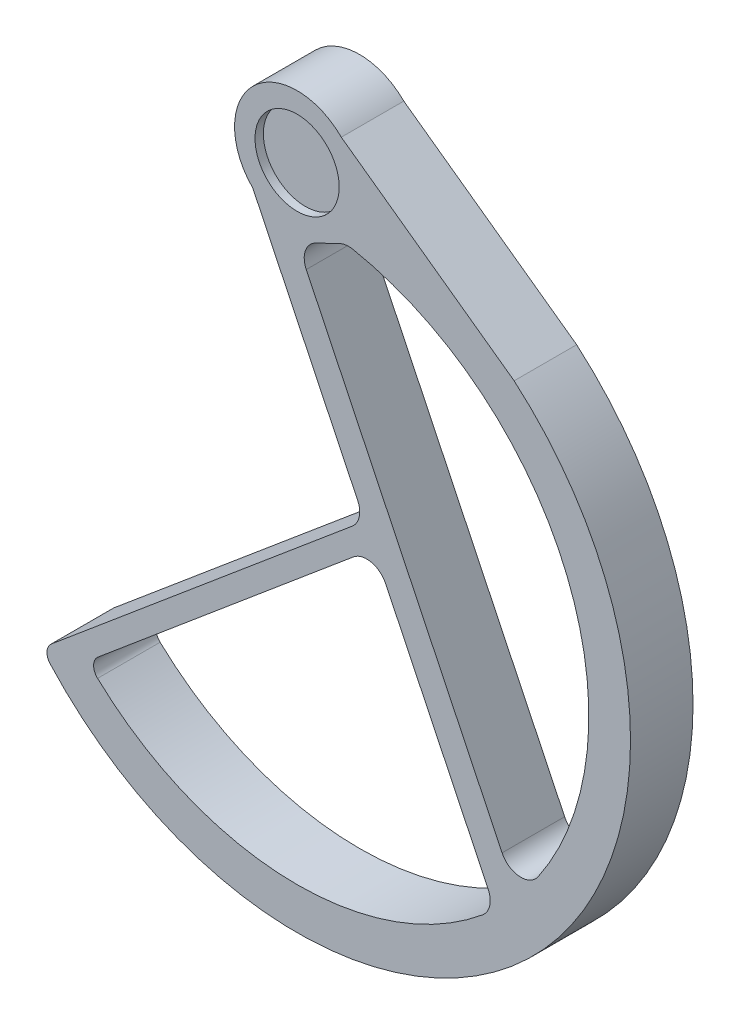
ISO-10303-21;
HEADER;
FILE_DESCRIPTION(('STEP AP214'),'2;1');
FILE_NAME('part.step','',(''),(''),'','','');
FILE_SCHEMA(('AUTOMOTIVE_DESIGN { 1 0 10303 214 1 1 1 1 }'));
ENDSEC;
DATA;
#1=APPLICATION_CONTEXT('core data for automotive mechanical design processes');
#2=APPLICATION_PROTOCOL_DEFINITION('international standard','automotive_design',2000,#1);
#3=PRODUCT_CONTEXT('',#1,'mechanical');
#4=PRODUCT('Part','Part','',(#3));
#5=PRODUCT_RELATED_PRODUCT_CATEGORY('part','',(#4));
#6=PRODUCT_DEFINITION_FORMATION('','',#4);
#7=PRODUCT_DEFINITION_CONTEXT('part definition',#1,'design');
#8=PRODUCT_DEFINITION('design','',#6,#7);
#9=PRODUCT_DEFINITION_SHAPE('','',#8);
#10=(LENGTH_UNIT() NAMED_UNIT(*) SI_UNIT(.MILLI.,.METRE.));
#11=(NAMED_UNIT(*) PLANE_ANGLE_UNIT() SI_UNIT($,.RADIAN.));
#12=(NAMED_UNIT(*) SI_UNIT($,.STERADIAN.) SOLID_ANGLE_UNIT());
#13=UNCERTAINTY_MEASURE_WITH_UNIT(LENGTH_MEASURE(1.E-05),#10,'distance_accuracy_value','');
#14=(GEOMETRIC_REPRESENTATION_CONTEXT(3) GLOBAL_UNCERTAINTY_ASSIGNED_CONTEXT((#13)) GLOBAL_UNIT_ASSIGNED_CONTEXT((#10,
#11,#12)) REPRESENTATION_CONTEXT('',''));
#15=CARTESIAN_POINT('',(0.,0.,0.));
#16=DIRECTION('',(0.,0.,1.));
#17=DIRECTION('',(1.,0.,0.));
#18=AXIS2_PLACEMENT_3D('',#15,#16,#17);
#19=CARTESIAN_POINT('',(-12.7570586950624,-6.1348621133076,15.));
#20=DIRECTION('',(0.901206602628173,0.433389731511241,0.));
#21=DIRECTION('',(-0.433389731511241,0.901206602628173,0.));
#22=AXIS2_PLACEMENT_3D('',#19,#20,#21);
#23=PLANE('',#22);
#24=DIRECTION('',(0.433389731511241,-0.901206602628173,0.));
#25=VECTOR('',#24,1.);
#26=CARTESIAN_POINT('',(-12.7570586950624,-6.1348621133076,0.));
#27=LINE('',#26,#25);
#28=CARTESIAN_POINT('',(21.2324006956412,-76.8137984043253,0.));
#29=VERTEX_POINT('',#28);
#30=CARTESIAN_POINT('',(45.844843506453,-127.9938203457,0.));
#31=VERTEX_POINT('',#30);
#32=EDGE_CURVE('E277',#29,#31,#27,.T.);
#33=ORIENTED_EDGE('',*,*,#32,.T.);
#34=DIRECTION('',(0.,0.,-1.));
#35=VECTOR('',#34,1.);
#36=CARTESIAN_POINT('',(45.844843506453,-127.9938203457,15.));
#37=LINE('',#36,#35);
#38=CARTESIAN_POINT('',(45.844843506453,-127.9938203457,15.));
#39=VERTEX_POINT('',#38);
#40=EDGE_CURVE('E11',#39,#31,#37,.T.);
#41=ORIENTED_EDGE('',*,*,#40,.F.);
#42=DIRECTION('',(0.433389731511241,-0.901206602628173,0.));
#43=VECTOR('',#42,1.);
#44=CARTESIAN_POINT('',(-12.7570586950624,-6.1348621133076,15.));
#45=LINE('',#44,#43);
#46=CARTESIAN_POINT('',(21.2324006956412,-76.8137984043253,15.));
#47=VERTEX_POINT('',#46);
#48=EDGE_CURVE('E243',#47,#39,#45,.T.);
#49=ORIENTED_EDGE('',*,*,#48,.F.);
#50=DIRECTION('',(0.,0.,-1.));
#51=VECTOR('',#50,1.);
#52=CARTESIAN_POINT('',(21.2324006956412,-76.8137984043253,15.));
#53=LINE('',#52,#51);
#54=EDGE_CURVE('E291',#47,#29,#53,.T.);
#55=ORIENTED_EDGE('',*,*,#54,.T.);
#56=EDGE_LOOP('',(#33,#41,#49,#55));
#57=FACE_BOUND('',#56,.T.);
#58=ADVANCED_FACE('F34',(#57),#23,.F.);
#59=CARTESIAN_POINT('',(41.3388104933121,-130.160769003256,15.));
#60=DIRECTION('',(0.,0.,-1.));
#61=DIRECTION('',(-1.,0.,0.));
#62=AXIS2_PLACEMENT_3D('',#59,#60,#61);
#63=CYLINDRICAL_SURFACE('',#62,4.99999999999999);
#64=CARTESIAN_POINT('',(41.3388104933121,-130.160769003256,0.));
#65=DIRECTION('',(0.,0.,1.));
#66=DIRECTION('',(1.,0.,0.));
#67=AXIS2_PLACEMENT_3D('',#64,#65,#66);
#68=CIRCLE('',#67,4.99999999999999);
#69=CARTESIAN_POINT('',(44.5187189927976,-134.019289695814,0.));
#70=VERTEX_POINT('',#69);
#71=EDGE_CURVE('E280',#31,#70,#68,.F.);
#72=ORIENTED_EDGE('',*,*,#71,.T.);
#73=DIRECTION('',(0.,0.,-1.));
#74=VECTOR('',#73,1.);
#75=CARTESIAN_POINT('',(44.5187189927976,-134.019289695814,15.));
#76=LINE('',#75,#74);
#77=CARTESIAN_POINT('',(44.5187189927976,-134.019289695814,15.));
#78=VERTEX_POINT('',#77);
#79=EDGE_CURVE('E43',#78,#70,#76,.T.);
#80=ORIENTED_EDGE('',*,*,#79,.F.);
#81=CARTESIAN_POINT('',(41.3388104933121,-130.160769003256,15.));
#82=DIRECTION('',(0.,0.,1.));
#83=DIRECTION('',(1.,0.,0.));
#84=AXIS2_PLACEMENT_3D('',#81,#82,#83);
#85=CIRCLE('',#84,4.99999999999999);
#86=EDGE_CURVE('E246',#39,#78,#85,.F.);
#87=ORIENTED_EDGE('',*,*,#86,.F.);
#88=ORIENTED_EDGE('',*,*,#40,.T.);
#89=EDGE_LOOP('',(#72,#80,#87,#88));
#90=FACE_BOUND('',#89,.T.);
#91=ADVANCED_FACE('F357',(#90),#63,.F.);
#92=CARTESIAN_POINT('',(0.,-80.,15.));
#93=DIRECTION('',(0.,0.,-1.));
#94=DIRECTION('',(-1.,0.,0.));
#95=AXIS2_PLACEMENT_3D('',#92,#93,#94);
#96=CYLINDRICAL_SURFACE('',#95,70.);
#97=CARTESIAN_POINT('',(0.,-80.,0.));
#98=DIRECTION('',(0.,0.,1.));
#99=DIRECTION('',(1.,0.,0.));
#100=AXIS2_PLACEMENT_3D('',#97,#98,#99);
#101=CIRCLE('',#100,70.);
#102=CARTESIAN_POINT('',(-47.870174388264,-131.072951785042,0.));
#103=VERTEX_POINT('',#102);
#104=EDGE_CURVE('E283',#103,#70,#101,.T.);
#105=ORIENTED_EDGE('',*,*,#104,.F.);
#106=DIRECTION('',(0.,0.,-1.));
#107=VECTOR('',#106,1.);
#108=CARTESIAN_POINT('',(-47.870174388264,-131.072951785042,15.));
#109=LINE('',#108,#107);
#110=CARTESIAN_POINT('',(-47.870174388264,-131.072951785042,15.));
#111=VERTEX_POINT('',#110);
#112=EDGE_CURVE('E300',#111,#103,#109,.T.);
#113=ORIENTED_EDGE('',*,*,#112,.F.);
#114=CARTESIAN_POINT('',(0.,-80.,15.));
#115=DIRECTION('',(0.,0.,1.));
#116=DIRECTION('',(1.,0.,0.));
#117=AXIS2_PLACEMENT_3D('',#114,#115,#116);
#118=CIRCLE('',#117,70.);
#119=EDGE_CURVE('E248',#111,#78,#118,.T.);
#120=ORIENTED_EDGE('',*,*,#119,.T.);
#121=ORIENTED_EDGE('',*,*,#79,.T.);
#122=EDGE_LOOP('',(#105,#113,#120,#121));
#123=FACE_BOUND('',#122,.T.);
#124=ADVANCED_FACE('F363',(#123),#96,.F.);
#125=CARTESIAN_POINT('',(-45.8185954859101,-128.884110994254,15.));
#126=DIRECTION('',(0.,0.,-1.));
#127=DIRECTION('',(-1.,0.,0.));
#128=AXIS2_PLACEMENT_3D('',#125,#126,#127);
#129=CYLINDRICAL_SURFACE('',#128,2.99999999999979);
#130=CARTESIAN_POINT('',(-45.8185954859101,-128.884110994254,0.));
#131=DIRECTION('',(0.,0.,1.));
#132=DIRECTION('',(1.,0.,0.));
#133=AXIS2_PLACEMENT_3D('',#130,#131,#132);
#134=CIRCLE('',#133,2.99999999999979);
#135=CARTESIAN_POINT('',(-47.7476784165524,-126.586582094174,0.));
#136=VERTEX_POINT('',#135);
#137=EDGE_CURVE('E286',#103,#136,#134,.F.);
#138=ORIENTED_EDGE('',*,*,#137,.T.);
#139=DIRECTION('',(0.,0.,-1.));
#140=VECTOR('',#139,1.);
#141=CARTESIAN_POINT('',(-47.7476784165524,-126.586582094174,15.));
#142=LINE('',#141,#140);
#143=CARTESIAN_POINT('',(-47.7476784165524,-126.586582094174,15.));
#144=VERTEX_POINT('',#143);
#145=EDGE_CURVE('E297',#144,#136,#142,.T.);
#146=ORIENTED_EDGE('',*,*,#145,.F.);
#147=CARTESIAN_POINT('',(-45.8185954859101,-128.884110994254,15.));
#148=DIRECTION('',(0.,0.,1.));
#149=DIRECTION('',(1.,0.,0.));
#150=AXIS2_PLACEMENT_3D('',#147,#148,#149);
#151=CIRCLE('',#150,2.99999999999979);
#152=EDGE_CURVE('E251',#111,#144,#151,.F.);
#153=ORIENTED_EDGE('',*,*,#152,.F.);
#154=ORIENTED_EDGE('',*,*,#112,.T.);
#155=EDGE_LOOP('',(#138,#146,#153,#154));
#156=FACE_BOUND('',#155,.T.);
#157=ADVANCED_FACE('F369',(#156),#129,.F.);
#158=CARTESIAN_POINT('',(42.5956727933285,-50.7312504333006,15.));
#159=DIRECTION('',(-0.643027643547508,0.765842966693394,0.));
#160=DIRECTION('',(-0.765842966693394,-0.643027643547508,0.));
#161=AXIS2_PLACEMENT_3D('',#158,#159,#160);
#162=PLANE('',#161);
#163=DIRECTION('',(0.765842966693394,0.643027643547508,0.));
#164=VECTOR('',#163,1.);
#165=CARTESIAN_POINT('',(42.5956727933285,-50.7312504333006,0.));
#166=LINE('',#165,#164);
#167=CARTESIAN_POINT('',(13.5112294647628,-75.1515322284145,0.));
#168=VERTEX_POINT('',#167);
#169=EDGE_CURVE('E288',#136,#168,#166,.T.);
#170=ORIENTED_EDGE('',*,*,#169,.T.);
#171=DIRECTION('',(0.,0.,-1.));
#172=VECTOR('',#171,1.);
#173=CARTESIAN_POINT('',(13.5112294647628,-75.1515322284145,15.));
#174=LINE('',#173,#172);
#175=CARTESIAN_POINT('',(13.5112294647628,-75.1515322284145,15.));
#176=VERTEX_POINT('',#175);
#177=EDGE_CURVE('E294',#176,#168,#174,.T.);
#178=ORIENTED_EDGE('',*,*,#177,.F.);
#179=DIRECTION('',(0.765842966693394,0.643027643547508,0.));
#180=VECTOR('',#179,1.);
#181=CARTESIAN_POINT('',(42.5956727933285,-50.7312504333006,15.));
#182=LINE('',#181,#180);
#183=EDGE_CURVE('E253',#144,#176,#182,.T.);
#184=ORIENTED_EDGE('',*,*,#183,.F.);
#185=ORIENTED_EDGE('',*,*,#145,.T.);
#186=EDGE_LOOP('',(#170,#178,#184,#185));
#187=FACE_BOUND('',#186,.T.);
#188=ADVANCED_FACE('F373',(#187),#162,.F.);
#189=CARTESIAN_POINT('',(10.0302471408598,-65.0565868768263,15.));
#190=DIRECTION('',(0.,0.,-1.));
#191=DIRECTION('',(-1.,0.,0.));
#192=AXIS2_PLACEMENT_3D('',#189,#190,#191);
#193=CYLINDRICAL_SURFACE('',#192,5.);
#194=CARTESIAN_POINT('',(10.0302471408598,-65.0565868768263,0.));
#195=DIRECTION('',(0.,0.,1.));
#196=DIRECTION('',(1.,0.,0.));
#197=AXIS2_PLACEMENT_3D('',#194,#195,#196);
#198=CIRCLE('',#197,5.);
#199=CARTESIAN_POINT('',(13.2441851892925,-68.8868090924212,0.));
#200=VERTEX_POINT('',#199);
#201=CARTESIAN_POINT('',(14.5362801540007,-62.8896382192701,0.));
#202=VERTEX_POINT('',#201);
#203=EDGE_CURVE('E216',#200,#202,#198,.T.);
#204=ORIENTED_EDGE('',*,*,#203,.F.);
#205=DIRECTION('',(0.,0.,-1.));
#206=VECTOR('',#205,1.);
#207=CARTESIAN_POINT('',(13.2441851892925,-68.8868090924212,15.));
#208=LINE('',#207,#206);
#209=CARTESIAN_POINT('',(13.2441851892925,-68.8868090924212,15.));
#210=VERTEX_POINT('',#209);
#211=EDGE_CURVE('E38',#210,#200,#208,.T.);
#212=ORIENTED_EDGE('',*,*,#211,.F.);
#213=CARTESIAN_POINT('',(10.0302471408598,-65.0565868768263,15.));
#214=DIRECTION('',(0.,0.,1.));
#215=DIRECTION('',(1.,0.,0.));
#216=AXIS2_PLACEMENT_3D('',#213,#214,#215);
#217=CIRCLE('',#216,5.);
#218=CARTESIAN_POINT('',(14.5362801540007,-62.8896382192701,15.));
#219=VERTEX_POINT('',#218);
#220=EDGE_CURVE('E224',#210,#219,#217,.T.);
#221=ORIENTED_EDGE('',*,*,#220,.T.);
#222=DIRECTION('',(0.,0.,-1.));
#223=VECTOR('',#222,1.);
#224=CARTESIAN_POINT('',(14.5362801540007,-62.8896382192701,15.));
#225=LINE('',#224,#223);
#226=EDGE_CURVE('E257',#219,#202,#225,.T.);
#227=ORIENTED_EDGE('',*,*,#226,.T.);
#228=EDGE_LOOP('',(#204,#212,#221,#227));
#229=FACE_BOUND('',#228,.T.);
#230=ADVANCED_FACE('F36',(#229),#193,.F.);
#231=CARTESIAN_POINT('',(39.3923101204882,-46.9459271066778,15.));
#232=DIRECTION('',(-0.642787609686534,0.766044443118983,0.));
#233=DIRECTION('',(-0.766044443118982,-0.642787609686534,0.));
#234=AXIS2_PLACEMENT_3D('',#231,#232,#233);
#235=PLANE('',#234);
#236=DIRECTION('',(0.766044443118982,0.642787609686534,0.));
#237=VECTOR('',#236,1.);
#238=CARTESIAN_POINT('',(39.3923101204882,-46.9459271066778,0.));
#239=LINE('',#238,#237);
#240=CARTESIAN_POINT('',(-58.9406362868111,-129.457066169617,0.));
#241=VERTEX_POINT('',#240);
#242=EDGE_CURVE('E260',#241,#200,#239,.T.);
#243=ORIENTED_EDGE('',*,*,#242,.F.);
#244=DIRECTION('',(0.,0.,-1.));
#245=VECTOR('',#244,1.);
#246=CARTESIAN_POINT('',(-58.9406362868111,-129.457066169617,15.));
#247=LINE('',#246,#245);
#248=CARTESIAN_POINT('',(-58.9406362868111,-129.457066169617,15.));
#249=VERTEX_POINT('',#248);
#250=EDGE_CURVE('E312',#249,#241,#247,.T.);
#251=ORIENTED_EDGE('',*,*,#250,.F.);
#252=DIRECTION('',(0.766044443118982,0.642787609686534,0.));
#253=VECTOR('',#252,1.);
#254=CARTESIAN_POINT('',(39.3923101204882,-46.9459271066778,15.));
#255=LINE('',#254,#253);
#256=EDGE_CURVE('E227',#249,#210,#255,.T.);
#257=ORIENTED_EDGE('',*,*,#256,.T.);
#258=ORIENTED_EDGE('',*,*,#211,.T.);
#259=EDGE_LOOP('',(#243,#251,#257,#258));
#260=FACE_BOUND('',#259,.T.);
#261=ADVANCED_FACE('F318',(#260),#235,.T.);
#262=CARTESIAN_POINT('',(-57.0122734577518,-131.755199498973,15.));
#263=DIRECTION('',(0.,0.,-1.));
#264=DIRECTION('',(-1.,0.,0.));
#265=AXIS2_PLACEMENT_3D('',#262,#263,#264);
#266=CYLINDRICAL_SURFACE('',#265,2.99999999999976);
#267=CARTESIAN_POINT('',(-57.0122734577518,-131.755199498973,0.));
#268=DIRECTION('',(0.,0.,1.));
#269=DIRECTION('',(1.,0.,0.));
#270=AXIS2_PLACEMENT_3D('',#267,#268,#269);
#271=CIRCLE('',#270,2.99999999999976);
#272=CARTESIAN_POINT('',(-59.2335308651964,-133.771635843089,0.));
#273=VERTEX_POINT('',#272);
#274=EDGE_CURVE('E263',#273,#241,#271,.F.);
#275=ORIENTED_EDGE('',*,*,#274,.F.);
#276=DIRECTION('',(0.,0.,-1.));
#277=VECTOR('',#276,1.);
#278=CARTESIAN_POINT('',(-59.2335308651964,-133.771635843089,15.));
#279=LINE('',#278,#277);
#280=CARTESIAN_POINT('',(-59.2335308651964,-133.771635843089,15.));
#281=VERTEX_POINT('',#280);
#282=EDGE_CURVE('E311',#281,#273,#279,.T.);
#283=ORIENTED_EDGE('',*,*,#282,.F.);
#284=CARTESIAN_POINT('',(-57.0122734577518,-131.755199498973,15.));
#285=DIRECTION('',(0.,0.,1.));
#286=DIRECTION('',(1.,0.,0.));
#287=AXIS2_PLACEMENT_3D('',#284,#285,#286);
#288=CIRCLE('',#287,2.99999999999976);
#289=EDGE_CURVE('E231',#281,#249,#288,.F.);
#290=ORIENTED_EDGE('',*,*,#289,.T.);
#291=ORIENTED_EDGE('',*,*,#250,.T.);
#292=EDGE_LOOP('',(#275,#283,#290,#291));
#293=FACE_BOUND('',#292,.T.);
#294=ADVANCED_FACE('F326',(#293),#266,.T.);
#295=CARTESIAN_POINT('',(0.,-80.,15.));
#296=DIRECTION('',(0.,0.,-1.));
#297=DIRECTION('',(-1.,0.,0.));
#298=AXIS2_PLACEMENT_3D('',#295,#296,#297);
#299=CYLINDRICAL_SURFACE('',#298,80.);
#300=CARTESIAN_POINT('',(0.,-80.,0.));
#301=DIRECTION('',(0.,0.,1.));
#302=DIRECTION('',(1.,0.,0.));
#303=AXIS2_PLACEMENT_3D('',#300,#301,#302);
#304=CIRCLE('',#303,80.);
#305=CARTESIAN_POINT('',(52.0761789176773,-19.2705047828153,0.));
#306=VERTEX_POINT('',#305);
#307=EDGE_CURVE('E266',#273,#306,#304,.T.);
#308=ORIENTED_EDGE('',*,*,#307,.T.);
#309=DIRECTION('',(0.,0.,-1.));
#310=VECTOR('',#309,1.);
#311=CARTESIAN_POINT('',(52.0761789176773,-19.2705047828153,15.));
#312=LINE('',#311,#310);
#313=CARTESIAN_POINT('',(52.0761789176773,-19.2705047828153,15.));
#314=VERTEX_POINT('',#313);
#315=EDGE_CURVE('E309',#314,#306,#312,.T.);
#316=ORIENTED_EDGE('',*,*,#315,.F.);
#317=CARTESIAN_POINT('',(0.,-80.,15.));
#318=DIRECTION('',(0.,0.,1.));
#319=DIRECTION('',(1.,0.,0.));
#320=AXIS2_PLACEMENT_3D('',#317,#318,#319);
#321=CIRCLE('',#320,80.);
#322=EDGE_CURVE('E234',#281,#314,#321,.T.);
#323=ORIENTED_EDGE('',*,*,#322,.F.);
#324=ORIENTED_EDGE('',*,*,#282,.T.);
#325=EDGE_LOOP('',(#308,#316,#323,#324));
#326=FACE_BOUND('',#325,.T.);
#327=ADVANCED_FACE('F331',(#326),#299,.T.);
#328=CARTESIAN_POINT('',(8.65474635415258,12.0128323695446,15.));
#329=DIRECTION('',(0.584549661802916,0.811357931424902,0.));
#330=DIRECTION('',(-0.811357931424902,0.584549661802916,0.));
#331=AXIS2_PLACEMENT_3D('',#328,#329,#330);
#332=PLANE('',#331);
#333=DIRECTION('',(0.811357931424902,-0.584549661802916,0.));
#334=VECTOR('',#333,1.);
#335=CARTESIAN_POINT('',(8.65474635415258,12.0128323695446,0.));
#336=LINE('',#335,#334);
#337=CARTESIAN_POINT('',(10.6066017177981,10.6066017177983,0.));
#338=VERTEX_POINT('',#337);
#339=EDGE_CURVE('E269',#338,#306,#336,.T.);
#340=ORIENTED_EDGE('',*,*,#339,.F.);
#341=DIRECTION('',(0.,0.,-1.));
#342=VECTOR('',#341,1.);
#343=CARTESIAN_POINT('',(10.6066017177981,10.6066017177983,15.));
#344=LINE('',#343,#342);
#345=CARTESIAN_POINT('',(10.6066017177981,10.6066017177983,15.));
#346=VERTEX_POINT('',#345);
#347=EDGE_CURVE('E307',#346,#338,#344,.T.);
#348=ORIENTED_EDGE('',*,*,#347,.F.);
#349=DIRECTION('',(0.811357931424902,-0.584549661802916,0.));
#350=VECTOR('',#349,1.);
#351=CARTESIAN_POINT('',(8.65474635415258,12.0128323695446,15.));
#352=LINE('',#351,#350);
#353=EDGE_CURVE('E236',#346,#314,#352,.T.);
#354=ORIENTED_EDGE('',*,*,#353,.T.);
#355=ORIENTED_EDGE('',*,*,#315,.T.);
#356=EDGE_LOOP('',(#340,#348,#354,#355));
#357=FACE_BOUND('',#356,.T.);
#358=ADVANCED_FACE('F345',(#357),#332,.T.);
#359=CARTESIAN_POINT('',(0.,0.,15.));
#360=DIRECTION('',(0.,0.,-1.));
#361=DIRECTION('',(-1.,0.,0.));
#362=AXIS2_PLACEMENT_3D('',#359,#360,#361);
#363=CYLINDRICAL_SURFACE('',#362,15.);
#364=CARTESIAN_POINT('',(0.,0.,0.));
#365=DIRECTION('',(0.,0.,1.));
#366=DIRECTION('',(1.,0.,0.));
#367=AXIS2_PLACEMENT_3D('',#364,#365,#366);
#368=CIRCLE('',#367,15.);
#369=CARTESIAN_POINT('',(-10.6066017177981,-10.6066017177983,0.));
#370=VERTEX_POINT('',#369);
#371=EDGE_CURVE('E272',#338,#370,#368,.T.);
#372=ORIENTED_EDGE('',*,*,#371,.T.);
#373=DIRECTION('',(0.,0.,-1.));
#374=VECTOR('',#373,1.);
#375=CARTESIAN_POINT('',(-10.6066017177981,-10.6066017177983,15.));
#376=LINE('',#375,#374);
#377=CARTESIAN_POINT('',(-10.6066017177981,-10.6066017177983,15.));
#378=VERTEX_POINT('',#377);
#379=EDGE_CURVE('E304',#378,#370,#376,.T.);
#380=ORIENTED_EDGE('',*,*,#379,.F.);
#381=CARTESIAN_POINT('',(0.,0.,15.));
#382=DIRECTION('',(0.,0.,1.));
#383=DIRECTION('',(1.,0.,0.));
#384=AXIS2_PLACEMENT_3D('',#381,#382,#383);
#385=CIRCLE('',#384,15.);
#386=EDGE_CURVE('E239',#346,#378,#385,.T.);
#387=ORIENTED_EDGE('',*,*,#386,.F.);
#388=ORIENTED_EDGE('',*,*,#347,.T.);
#389=EDGE_LOOP('',(#372,#380,#387,#388));
#390=FACE_BOUND('',#389,.T.);
#391=ADVANCED_FACE('F346',(#390),#363,.T.);
#392=CARTESIAN_POINT('',(-12.7570586950624,-6.13486211330761,15.));
#393=DIRECTION('',(0.901206602628173,0.433389731511242,0.));
#394=DIRECTION('',(-0.433389731511242,0.901206602628173,0.));
#395=AXIS2_PLACEMENT_3D('',#392,#393,#394);
#396=PLANE('',#395);
#397=DIRECTION('',(0.433389731511242,-0.901206602628173,0.));
#398=VECTOR('',#397,1.);
#399=CARTESIAN_POINT('',(-12.7570586950624,-6.13486211330761,0.));
#400=LINE('',#399,#398);
#401=EDGE_CURVE('E274',#370,#202,#400,.T.);
#402=ORIENTED_EDGE('',*,*,#401,.T.);
#403=ORIENTED_EDGE('',*,*,#226,.F.);
#404=DIRECTION('',(0.433389731511242,-0.901206602628173,0.));
#405=VECTOR('',#404,1.);
#406=CARTESIAN_POINT('',(-12.7570586950624,-6.13486211330761,15.));
#407=LINE('',#406,#405);
#408=EDGE_CURVE('E241',#378,#219,#407,.T.);
#409=ORIENTED_EDGE('',*,*,#408,.F.);
#410=ORIENTED_EDGE('',*,*,#379,.T.);
#411=EDGE_LOOP('',(#402,#403,#409,#410));
#412=FACE_BOUND('',#411,.T.);
#413=ADVANCED_FACE('F340',(#412),#396,.F.);
#414=CARTESIAN_POINT('',(16.7263676825004,-78.9807470618814,15.));
#415=DIRECTION('',(0.,0.,-1.));
#416=DIRECTION('',(-1.,0.,0.));
#417=AXIS2_PLACEMENT_3D('',#414,#415,#416);
#418=CYLINDRICAL_SURFACE('',#417,5.);
#419=CARTESIAN_POINT('',(16.7263676825004,-78.9807470618814,0.));
#420=DIRECTION('',(0.,0.,1.));
#421=DIRECTION('',(1.,0.,0.));
#422=AXIS2_PLACEMENT_3D('',#419,#420,#421);
#423=CIRCLE('',#422,5.);
#424=EDGE_CURVE('E228',#168,#29,#423,.F.);
#425=ORIENTED_EDGE('',*,*,#424,.T.);
#426=ORIENTED_EDGE('',*,*,#54,.F.);
#427=CARTESIAN_POINT('',(16.7263676825004,-78.9807470618814,15.));
#428=DIRECTION('',(0.,0.,1.));
#429=DIRECTION('',(1.,0.,0.));
#430=AXIS2_PLACEMENT_3D('',#427,#428,#429);
#431=CIRCLE('',#430,5.);
#432=EDGE_CURVE('E255',#176,#47,#431,.F.);
#433=ORIENTED_EDGE('',*,*,#432,.F.);
#434=ORIENTED_EDGE('',*,*,#177,.T.);
#435=EDGE_LOOP('',(#425,#426,#433,#434));
#436=FACE_BOUND('',#435,.T.);
#437=ADVANCED_FACE('F353',(#436),#418,.F.);
#438=CARTESIAN_POINT('',(0.,0.,15.));
#439=DIRECTION('',(0.,0.,1.));
#440=DIRECTION('',(1.,0.,0.));
#441=AXIS2_PLACEMENT_3D('',#438,#439,#440);
#442=PLANE('',#441);
#443=CARTESIAN_POINT('',(0.,0.,15.));
#444=DIRECTION('',(0.,0.,1.));
#445=DIRECTION('',(1.,0.,0.));
#446=AXIS2_PLACEMENT_3D('',#443,#444,#445);
#447=CIRCLE('',#446,10.1);
#448=CARTESIAN_POINT('',(10.1,0.,15.));
#449=VERTEX_POINT('',#448);
#450=EDGE_CURVE('E192',#449,#449,#447,.T.);
#451=ORIENTED_EDGE('',*,*,#450,.F.);
#452=EDGE_LOOP('',(#451));
#453=FACE_BOUND('',#452,.T.);
#454=CARTESIAN_POINT('',(6.70778479931193,-18.9220720384942,15.));
#455=DIRECTION('',(0.,0.,1.));
#456=DIRECTION('',(-1.,0.,0.));
#457=AXIS2_PLACEMENT_3D('',#454,#455,#456);
#458=CIRCLE('',#457,5.);
#459=CARTESIAN_POINT('',(4.54083614175573,-14.4160390253533,15.));
#460=VERTEX_POINT('',#459);
#461=CARTESIAN_POINT('',(2.20175178617109,-21.0890206960504,15.));
#462=VERTEX_POINT('',#461);
#463=EDGE_CURVE('E51',#460,#462,#458,.T.);
#464=ORIENTED_EDGE('',*,*,#463,.F.);
#465=DIRECTION('',(-0.901206602628171,-0.433389731511247,0.));
#466=VECTOR('',#465,1.);
#467=CARTESIAN_POINT('',(6.4834156052804,-13.4818536901804,15.));
#468=LINE('',#467,#466);
#469=CARTESIAN_POINT('',(10.2196588467731,-11.6850964864837,15.));
#470=VERTEX_POINT('',#469);
#471=EDGE_CURVE('E186',#470,#460,#468,.T.);
#472=ORIENTED_EDGE('',*,*,#471,.F.);
#473=CARTESIAN_POINT('',(12.3866075043293,-16.1911294996245,15.));
#474=DIRECTION('',(0.,0.,1.));
#475=DIRECTION('',(1.,0.,0.));
#476=AXIS2_PLACEMENT_3D('',#473,#474,#475);
#477=CIRCLE('',#476,5.);
#478=CARTESIAN_POINT('',(13.3394234662008,-11.2827548457495,15.));
#479=VERTEX_POINT('',#478);
#480=EDGE_CURVE('E189',#479,#470,#477,.T.);
#481=ORIENTED_EDGE('',*,*,#480,.F.);
#482=CARTESIAN_POINT('',(0.,-80.,15.));
#483=DIRECTION('',(0.,0.,1.));
#484=DIRECTION('',(1.,0.,0.));
#485=AXIS2_PLACEMENT_3D('',#482,#483,#484);
#486=CIRCLE('',#485,69.9999999999999);
#487=CARTESIAN_POINT('',(57.8260553336624,-119.448033215209,15.));
#488=VERTEX_POINT('',#487);
#489=EDGE_CURVE('E209',#488,#479,#486,.T.);
#490=ORIENTED_EDGE('',*,*,#489,.F.);
#491=CARTESIAN_POINT('',(53.6956228098294,-116.63031655698,15.));
#492=DIRECTION('',(0.,0.,1.));
#493=DIRECTION('',(-1.,0.,0.));
#494=AXIS2_PLACEMENT_3D('',#491,#492,#493);
#495=CIRCLE('',#494,5.);
#496=CARTESIAN_POINT('',(49.1895897966885,-118.797265214536,15.));
#497=VERTEX_POINT('',#496);
#498=EDGE_CURVE('E206',#497,#488,#495,.T.);
#499=ORIENTED_EDGE('',*,*,#498,.F.);
#500=DIRECTION('',(0.433389731511244,-0.901206602628172,0.));
#501=VECTOR('',#500,1.);
#502=CARTESIAN_POINT('',(49.1895897966885,-118.797265214536,15.));
#503=LINE('',#502,#501);
#504=EDGE_CURVE('E203',#462,#497,#503,.T.);
#505=ORIENTED_EDGE('',*,*,#504,.F.);
#506=EDGE_LOOP('',(#464,#472,#481,#490,#499,#505));
#507=FACE_BOUND('',#506,.T.);
#508=ORIENTED_EDGE('',*,*,#220,.F.);
#509=ORIENTED_EDGE('',*,*,#256,.F.);
#510=ORIENTED_EDGE('',*,*,#289,.F.);
#511=ORIENTED_EDGE('',*,*,#322,.T.);
#512=ORIENTED_EDGE('',*,*,#353,.F.);
#513=ORIENTED_EDGE('',*,*,#386,.T.);
#514=ORIENTED_EDGE('',*,*,#408,.T.);
#515=EDGE_LOOP('',(#508,#509,#510,#511,#512,#513,#514));
#516=FACE_BOUND('',#515,.T.);
#517=ORIENTED_EDGE('',*,*,#48,.T.);
#518=ORIENTED_EDGE('',*,*,#86,.T.);
#519=ORIENTED_EDGE('',*,*,#119,.F.);
#520=ORIENTED_EDGE('',*,*,#152,.T.);
#521=ORIENTED_EDGE('',*,*,#183,.T.);
#522=ORIENTED_EDGE('',*,*,#432,.T.);
#523=EDGE_LOOP('',(#517,#518,#519,#520,#521,#522));
#524=FACE_BOUND('',#523,.T.);
#525=ADVANCED_FACE('F334',(#453,#507,#516,#524),#442,.T.);
#526=CARTESIAN_POINT('',(0.,0.,0.));
#527=DIRECTION('',(0.,0.,1.));
#528=DIRECTION('',(1.,0.,0.));
#529=AXIS2_PLACEMENT_3D('',#526,#527,#528);
#530=PLANE('',#529);
#531=DIRECTION('',(-0.90120660262817,-0.433389731511248,0.));
#532=VECTOR('',#531,1.);
#533=CARTESIAN_POINT('',(6.4834156052804,-13.4818536901804,0.));
#534=LINE('',#533,#532);
#535=CARTESIAN_POINT('',(10.2196588467731,-11.6850964864837,0.));
#536=VERTEX_POINT('',#535);
#537=CARTESIAN_POINT('',(4.54083614175573,-14.4160390253533,0.));
#538=VERTEX_POINT('',#537);
#539=EDGE_CURVE('E175',#536,#538,#534,.T.);
#540=ORIENTED_EDGE('',*,*,#539,.T.);
#541=CARTESIAN_POINT('',(6.70778479931193,-18.9220720384942,0.));
#542=DIRECTION('',(0.,0.,1.));
#543=DIRECTION('',(-1.,0.,0.));
#544=AXIS2_PLACEMENT_3D('',#541,#542,#543);
#545=CIRCLE('',#544,5.);
#546=CARTESIAN_POINT('',(2.20175178617109,-21.0890206960504,0.));
#547=VERTEX_POINT('',#546);
#548=EDGE_CURVE('E169',#538,#547,#545,.T.);
#549=ORIENTED_EDGE('',*,*,#548,.T.);
#550=DIRECTION('',(0.433389731511244,-0.901206602628172,0.));
#551=VECTOR('',#550,1.);
#552=CARTESIAN_POINT('',(49.1895897966885,-118.797265214536,0.));
#553=LINE('',#552,#551);
#554=CARTESIAN_POINT('',(49.1895897966885,-118.797265214536,0.));
#555=VERTEX_POINT('',#554);
#556=EDGE_CURVE('E178',#547,#555,#553,.T.);
#557=ORIENTED_EDGE('',*,*,#556,.T.);
#558=CARTESIAN_POINT('',(53.6956228098294,-116.63031655698,0.));
#559=DIRECTION('',(0.,0.,1.));
#560=DIRECTION('',(-1.,0.,0.));
#561=AXIS2_PLACEMENT_3D('',#558,#559,#560);
#562=CIRCLE('',#561,5.);
#563=CARTESIAN_POINT('',(57.8260553336624,-119.448033215209,0.));
#564=VERTEX_POINT('',#563);
#565=EDGE_CURVE('E59',#555,#564,#562,.T.);
#566=ORIENTED_EDGE('',*,*,#565,.T.);
#567=CARTESIAN_POINT('',(0.,-80.,0.));
#568=DIRECTION('',(0.,0.,1.));
#569=DIRECTION('',(1.,0.,0.));
#570=AXIS2_PLACEMENT_3D('',#567,#568,#569);
#571=CIRCLE('',#570,69.9999999999999);
#572=CARTESIAN_POINT('',(13.3394234662008,-11.2827548457495,0.));
#573=VERTEX_POINT('',#572);
#574=EDGE_CURVE('E196',#564,#573,#571,.T.);
#575=ORIENTED_EDGE('',*,*,#574,.T.);
#576=CARTESIAN_POINT('',(12.3866075043293,-16.1911294996245,0.));
#577=DIRECTION('',(0.,0.,1.));
#578=DIRECTION('',(1.,0.,0.));
#579=AXIS2_PLACEMENT_3D('',#576,#577,#578);
#580=CIRCLE('',#579,5.);
#581=EDGE_CURVE('E199',#573,#536,#580,.T.);
#582=ORIENTED_EDGE('',*,*,#581,.T.);
#583=EDGE_LOOP('',(#540,#549,#557,#566,#575,#582));
#584=FACE_BOUND('',#583,.T.);
#585=ORIENTED_EDGE('',*,*,#203,.T.);
#586=ORIENTED_EDGE('',*,*,#401,.F.);
#587=ORIENTED_EDGE('',*,*,#371,.F.);
#588=ORIENTED_EDGE('',*,*,#339,.T.);
#589=ORIENTED_EDGE('',*,*,#307,.F.);
#590=ORIENTED_EDGE('',*,*,#274,.T.);
#591=ORIENTED_EDGE('',*,*,#242,.T.);
#592=EDGE_LOOP('',(#585,#586,#587,#588,#589,#590,#591));
#593=FACE_BOUND('',#592,.T.);
#594=ORIENTED_EDGE('',*,*,#32,.F.);
#595=ORIENTED_EDGE('',*,*,#424,.F.);
#596=ORIENTED_EDGE('',*,*,#169,.F.);
#597=ORIENTED_EDGE('',*,*,#137,.F.);
#598=ORIENTED_EDGE('',*,*,#104,.T.);
#599=ORIENTED_EDGE('',*,*,#71,.F.);
#600=EDGE_LOOP('',(#594,#595,#596,#597,#598,#599));
#601=FACE_BOUND('',#600,.T.);
#602=ADVANCED_FACE('F182',(#584,#593,#601),#530,.F.);
#603=CARTESIAN_POINT('',(6.70778479931193,-18.9220720384942,0.));
#604=DIRECTION('',(0.,0.,1.));
#605=DIRECTION('',(1.,0.,0.));
#606=AXIS2_PLACEMENT_3D('',#603,#604,#605);
#607=CYLINDRICAL_SURFACE('',#606,5.);
#608=ORIENTED_EDGE('',*,*,#463,.T.);
#609=DIRECTION('',(0.,0.,1.));
#610=VECTOR('',#609,1.);
#611=CARTESIAN_POINT('',(2.20175178617109,-21.0890206960504,0.));
#612=LINE('',#611,#610);
#613=EDGE_CURVE('E165',#547,#462,#612,.T.);
#614=ORIENTED_EDGE('',*,*,#613,.F.);
#615=ORIENTED_EDGE('',*,*,#548,.F.);
#616=DIRECTION('',(0.,0.,1.));
#617=VECTOR('',#616,1.);
#618=CARTESIAN_POINT('',(4.54083614175573,-14.4160390253533,0.));
#619=LINE('',#618,#617);
#620=EDGE_CURVE('E214',#538,#460,#619,.T.);
#621=ORIENTED_EDGE('',*,*,#620,.T.);
#622=EDGE_LOOP('',(#608,#614,#615,#621));
#623=FACE_BOUND('',#622,.T.);
#624=ADVANCED_FACE('F167',(#623),#607,.F.);
#625=CARTESIAN_POINT('',(6.4834156052804,-13.4818536901804,0.));
#626=DIRECTION('',(-0.433389731511247,0.901206602628171,0.));
#627=DIRECTION('',(-0.901206602628171,-0.433389731511247,0.));
#628=AXIS2_PLACEMENT_3D('',#625,#626,#627);
#629=PLANE('',#628);
#630=ORIENTED_EDGE('',*,*,#471,.T.);
#631=ORIENTED_EDGE('',*,*,#620,.F.);
#632=ORIENTED_EDGE('',*,*,#539,.F.);
#633=DIRECTION('',(0.,0.,1.));
#634=VECTOR('',#633,1.);
#635=CARTESIAN_POINT('',(10.2196588467731,-11.6850964864837,0.));
#636=LINE('',#635,#634);
#637=EDGE_CURVE('E217',#536,#470,#636,.T.);
#638=ORIENTED_EDGE('',*,*,#637,.T.);
#639=EDGE_LOOP('',(#630,#631,#632,#638));
#640=FACE_BOUND('',#639,.T.);
#641=ADVANCED_FACE('F388',(#640),#629,.F.);
#642=CARTESIAN_POINT('',(12.3866075043293,-16.1911294996245,0.));
#643=DIRECTION('',(0.,0.,1.));
#644=DIRECTION('',(1.,0.,0.));
#645=AXIS2_PLACEMENT_3D('',#642,#643,#644);
#646=CYLINDRICAL_SURFACE('',#645,5.);
#647=ORIENTED_EDGE('',*,*,#480,.T.);
#648=ORIENTED_EDGE('',*,*,#637,.F.);
#649=ORIENTED_EDGE('',*,*,#581,.F.);
#650=DIRECTION('',(0.,0.,1.));
#651=VECTOR('',#650,1.);
#652=CARTESIAN_POINT('',(13.3394234662008,-11.2827548457495,0.));
#653=LINE('',#652,#651);
#654=EDGE_CURVE('E219',#573,#479,#653,.T.);
#655=ORIENTED_EDGE('',*,*,#654,.T.);
#656=EDGE_LOOP('',(#647,#648,#649,#655));
#657=FACE_BOUND('',#656,.T.);
#658=ADVANCED_FACE('F398',(#657),#646,.F.);
#659=CARTESIAN_POINT('',(0.,-80.,0.));
#660=DIRECTION('',(0.,0.,1.));
#661=DIRECTION('',(1.,0.,0.));
#662=AXIS2_PLACEMENT_3D('',#659,#660,#661);
#663=CYLINDRICAL_SURFACE('',#662,69.9999999999999);
#664=ORIENTED_EDGE('',*,*,#489,.T.);
#665=ORIENTED_EDGE('',*,*,#654,.F.);
#666=ORIENTED_EDGE('',*,*,#574,.F.);
#667=DIRECTION('',(0.,0.,1.));
#668=VECTOR('',#667,1.);
#669=CARTESIAN_POINT('',(57.8260553336624,-119.448033215209,0.));
#670=LINE('',#669,#668);
#671=EDGE_CURVE('E221',#564,#488,#670,.T.);
#672=ORIENTED_EDGE('',*,*,#671,.T.);
#673=EDGE_LOOP('',(#664,#665,#666,#672));
#674=FACE_BOUND('',#673,.T.);
#675=ADVANCED_FACE('F395',(#674),#663,.F.);
#676=CARTESIAN_POINT('',(53.6956228098294,-116.63031655698,0.));
#677=DIRECTION('',(0.,0.,1.));
#678=DIRECTION('',(1.,0.,0.));
#679=AXIS2_PLACEMENT_3D('',#676,#677,#678);
#680=CYLINDRICAL_SURFACE('',#679,5.);
#681=ORIENTED_EDGE('',*,*,#498,.T.);
#682=ORIENTED_EDGE('',*,*,#671,.F.);
#683=ORIENTED_EDGE('',*,*,#565,.F.);
#684=DIRECTION('',(0.,0.,1.));
#685=VECTOR('',#684,1.);
#686=CARTESIAN_POINT('',(49.1895897966885,-118.797265214536,0.));
#687=LINE('',#686,#685);
#688=EDGE_CURVE('E174',#555,#497,#687,.T.);
#689=ORIENTED_EDGE('',*,*,#688,.T.);
#690=EDGE_LOOP('',(#681,#682,#683,#689));
#691=FACE_BOUND('',#690,.T.);
#692=ADVANCED_FACE('F392',(#691),#680,.F.);
#693=CARTESIAN_POINT('',(49.1895897966885,-118.797265214536,0.));
#694=DIRECTION('',(-0.901206602628172,-0.433389731511244,0.));
#695=DIRECTION('',(0.433389731511244,-0.901206602628172,0.));
#696=AXIS2_PLACEMENT_3D('',#693,#694,#695);
#697=PLANE('',#696);
#698=ORIENTED_EDGE('',*,*,#504,.T.);
#699=ORIENTED_EDGE('',*,*,#688,.F.);
#700=ORIENTED_EDGE('',*,*,#556,.F.);
#701=ORIENTED_EDGE('',*,*,#613,.T.);
#702=EDGE_LOOP('',(#698,#699,#700,#701));
#703=FACE_BOUND('',#702,.T.);
#704=ADVANCED_FACE('F179',(#703),#697,.F.);
#705=CARTESIAN_POINT('',(0.,0.,13.));
#706=DIRECTION('',(0.,0.,1.));
#707=DIRECTION('',(1.,0.,0.));
#708=AXIS2_PLACEMENT_3D('',#705,#706,#707);
#709=CYLINDRICAL_SURFACE('',#708,10.1);
#710=CARTESIAN_POINT('',(0.,0.,13.));
#711=DIRECTION('',(0.,0.,1.));
#712=DIRECTION('',(1.,0.,0.));
#713=AXIS2_PLACEMENT_3D('',#710,#711,#712);
#714=CIRCLE('',#713,10.1);
#715=CARTESIAN_POINT('',(10.1,0.,13.));
#716=VERTEX_POINT('',#715);
#717=EDGE_CURVE('E204',#716,#716,#714,.T.);
#718=ORIENTED_EDGE('',*,*,#717,.F.);
#719=EDGE_LOOP('',(#718));
#720=FACE_BOUND('',#719,.T.);
#721=ORIENTED_EDGE('',*,*,#450,.T.);
#722=EDGE_LOOP('',(#721));
#723=FACE_BOUND('',#722,.T.);
#724=ADVANCED_FACE('F391',(#720,#723),#709,.F.);
#725=CARTESIAN_POINT('',(0.,0.,13.));
#726=DIRECTION('',(0.,0.,1.));
#727=DIRECTION('',(1.,0.,0.));
#728=AXIS2_PLACEMENT_3D('',#725,#726,#727);
#729=PLANE('',#728);
#730=ORIENTED_EDGE('',*,*,#717,.T.);
#731=EDGE_LOOP('',(#730));
#732=FACE_BOUND('',#731,.T.);
#733=ADVANCED_FACE('F408',(#732),#729,.T.);
#734=CLOSED_SHELL('',(#58,#91,#124,#157,#188,#230,#261,#294,#327,#358,#391,#413,#437,#525,#602,
#624,#641,#658,#675,#692,#704,#724,#733));
#735=MANIFOLD_SOLID_BREP('B2',#734);
#736=ADVANCED_BREP_SHAPE_REPRESENTATION('',(#18,#735),#14);
#737=SHAPE_DEFINITION_REPRESENTATION(#9,#736);
ENDSEC;
END-ISO-10303-21;
